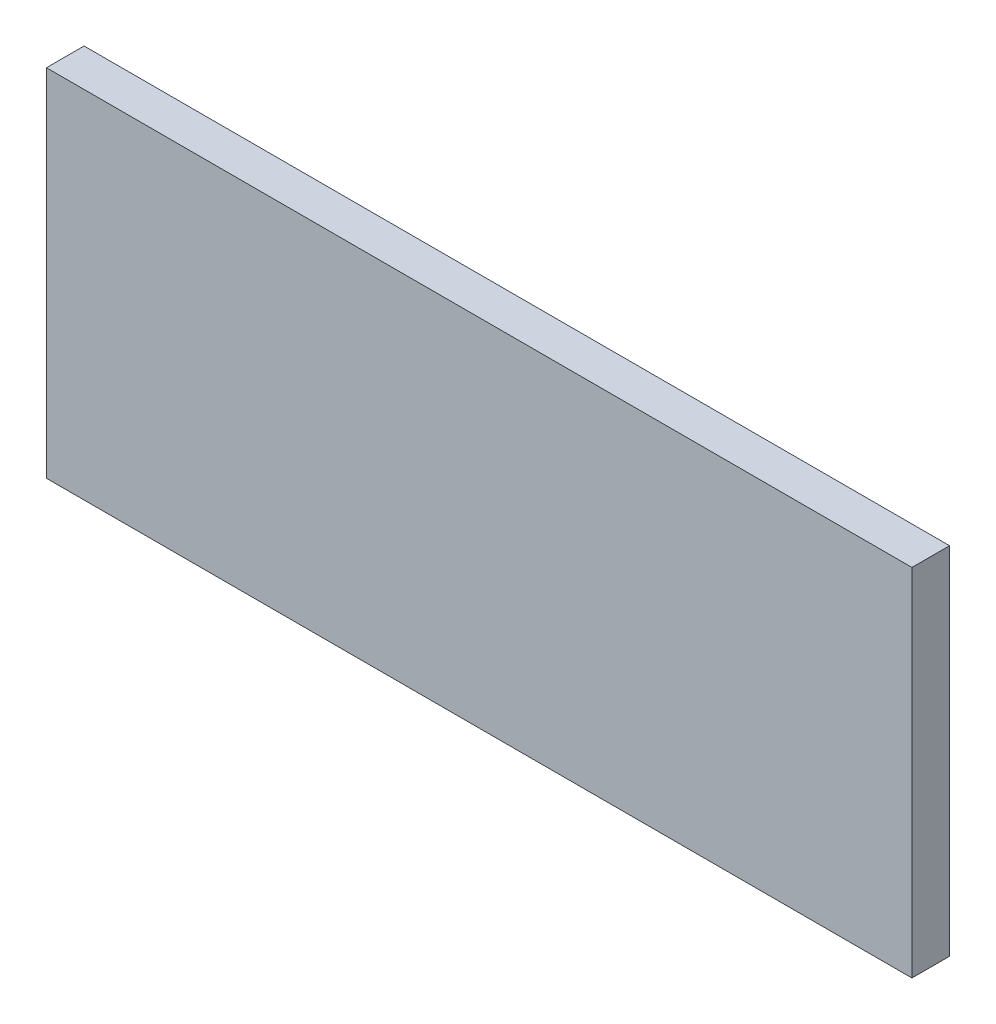
ISO-10303-21;
HEADER;
FILE_DESCRIPTION(('STEP AP214'),'2;1');
FILE_NAME('part.step','',(''),(''),'','','');
FILE_SCHEMA(('AUTOMOTIVE_DESIGN { 1 0 10303 214 1 1 1 1 }'));
ENDSEC;
DATA;
#1=APPLICATION_CONTEXT('core data for automotive mechanical design processes');
#2=APPLICATION_PROTOCOL_DEFINITION('international standard','automotive_design',2000,#1);
#3=PRODUCT_CONTEXT('',#1,'mechanical');
#4=PRODUCT('Part','Part','',(#3));
#5=PRODUCT_RELATED_PRODUCT_CATEGORY('part','',(#4));
#6=PRODUCT_DEFINITION_FORMATION('','',#4);
#7=PRODUCT_DEFINITION_CONTEXT('part definition',#1,'design');
#8=PRODUCT_DEFINITION('design','',#6,#7);
#9=PRODUCT_DEFINITION_SHAPE('','',#8);
#10=(LENGTH_UNIT() NAMED_UNIT(*) SI_UNIT(.MILLI.,.METRE.));
#11=(NAMED_UNIT(*) PLANE_ANGLE_UNIT() SI_UNIT($,.RADIAN.));
#12=(NAMED_UNIT(*) SI_UNIT($,.STERADIAN.) SOLID_ANGLE_UNIT());
#13=UNCERTAINTY_MEASURE_WITH_UNIT(LENGTH_MEASURE(1.E-05),#10,'distance_accuracy_value','');
#14=(GEOMETRIC_REPRESENTATION_CONTEXT(3) GLOBAL_UNCERTAINTY_ASSIGNED_CONTEXT((#13)) GLOBAL_UNIT_ASSIGNED_CONTEXT((#10,
#11,#12)) REPRESENTATION_CONTEXT('',''));
#15=CARTESIAN_POINT('',(0.,0.,0.));
#16=DIRECTION('',(0.,0.,1.));
#17=DIRECTION('',(1.,0.,0.));
#18=AXIS2_PLACEMENT_3D('',#15,#16,#17);
#19=CARTESIAN_POINT('',(-146.05,-60.,12.7));
#20=DIRECTION('',(0.,1.,0.));
#21=DIRECTION('',(-1.,0.,0.));
#22=AXIS2_PLACEMENT_3D('',#19,#20,#21);
#23=PLANE('',#22);
#24=DIRECTION('',(1.,0.,0.));
#25=VECTOR('',#24,1.);
#26=CARTESIAN_POINT('',(-146.05,-60.,0.));
#27=LINE('',#26,#25);
#28=CARTESIAN_POINT('',(-146.05,-60.,0.));
#29=VERTEX_POINT('',#28);
#30=CARTESIAN_POINT('',(146.05,-60.,0.));
#31=VERTEX_POINT('',#30);
#32=EDGE_CURVE('E107',#29,#31,#27,.T.);
#33=ORIENTED_EDGE('',*,*,#32,.T.);
#34=DIRECTION('',(0.,0.,-1.));
#35=VECTOR('',#34,1.);
#36=CARTESIAN_POINT('',(146.05,-60.,12.7));
#37=LINE('',#36,#35);
#38=CARTESIAN_POINT('',(146.05,-60.,12.7));
#39=VERTEX_POINT('',#38);
#40=EDGE_CURVE('E11',#39,#31,#37,.T.);
#41=ORIENTED_EDGE('',*,*,#40,.F.);
#42=DIRECTION('',(1.,0.,0.));
#43=VECTOR('',#42,1.);
#44=CARTESIAN_POINT('',(-146.05,-60.,12.7));
#45=LINE('',#44,#43);
#46=CARTESIAN_POINT('',(-146.05,-60.,12.7));
#47=VERTEX_POINT('',#46);
#48=EDGE_CURVE('E91',#47,#39,#45,.T.);
#49=ORIENTED_EDGE('',*,*,#48,.F.);
#50=DIRECTION('',(0.,0.,-1.));
#51=VECTOR('',#50,1.);
#52=CARTESIAN_POINT('',(-146.05,-60.,12.7));
#53=LINE('',#52,#51);
#54=EDGE_CURVE('E103',#47,#29,#53,.T.);
#55=ORIENTED_EDGE('',*,*,#54,.T.);
#56=EDGE_LOOP('',(#33,#41,#49,#55));
#57=FACE_BOUND('',#56,.T.);
#58=ADVANCED_FACE('F39',(#57),#23,.F.);
#59=CARTESIAN_POINT('',(146.05,-60.,12.7));
#60=DIRECTION('',(-1.,0.,0.));
#61=DIRECTION('',(0.,0.,1.));
#62=AXIS2_PLACEMENT_3D('',#59,#60,#61);
#63=PLANE('',#62);
#64=DIRECTION('',(0.,1.,0.));
#65=VECTOR('',#64,1.);
#66=CARTESIAN_POINT('',(146.05,-60.,0.));
#67=LINE('',#66,#65);
#68=CARTESIAN_POINT('',(146.05,60.,0.));
#69=VERTEX_POINT('',#68);
#70=EDGE_CURVE('E96',#31,#69,#67,.T.);
#71=ORIENTED_EDGE('',*,*,#70,.T.);
#72=DIRECTION('',(0.,0.,-1.));
#73=VECTOR('',#72,1.);
#74=CARTESIAN_POINT('',(146.05,60.,12.7));
#75=LINE('',#74,#73);
#76=CARTESIAN_POINT('',(146.05,60.,12.7));
#77=VERTEX_POINT('',#76);
#78=EDGE_CURVE('E48',#77,#69,#75,.T.);
#79=ORIENTED_EDGE('',*,*,#78,.F.);
#80=DIRECTION('',(0.,1.,0.));
#81=VECTOR('',#80,1.);
#82=CARTESIAN_POINT('',(146.05,-60.,12.7));
#83=LINE('',#82,#81);
#84=EDGE_CURVE('E86',#39,#77,#83,.T.);
#85=ORIENTED_EDGE('',*,*,#84,.F.);
#86=ORIENTED_EDGE('',*,*,#40,.T.);
#87=EDGE_LOOP('',(#71,#79,#85,#86));
#88=FACE_BOUND('',#87,.T.);
#89=ADVANCED_FACE('F95',(#88),#63,.F.);
#90=CARTESIAN_POINT('',(-146.05,60.,12.7));
#91=DIRECTION('',(0.,-1.,0.));
#92=DIRECTION('',(1.,0.,0.));
#93=AXIS2_PLACEMENT_3D('',#90,#91,#92);
#94=PLANE('',#93);
#95=DIRECTION('',(-1.,0.,0.));
#96=VECTOR('',#95,1.);
#97=CARTESIAN_POINT('',(-146.05,60.,0.));
#98=LINE('',#97,#96);
#99=CARTESIAN_POINT('',(-146.05,60.,0.));
#100=VERTEX_POINT('',#99);
#101=EDGE_CURVE('E73',#69,#100,#98,.T.);
#102=ORIENTED_EDGE('',*,*,#101,.T.);
#103=DIRECTION('',(0.,0.,-1.));
#104=VECTOR('',#103,1.);
#105=CARTESIAN_POINT('',(-146.05,60.,12.7));
#106=LINE('',#105,#104);
#107=CARTESIAN_POINT('',(-146.05,60.,12.7));
#108=VERTEX_POINT('',#107);
#109=EDGE_CURVE('E98',#108,#100,#106,.T.);
#110=ORIENTED_EDGE('',*,*,#109,.F.);
#111=DIRECTION('',(-1.,0.,0.));
#112=VECTOR('',#111,1.);
#113=CARTESIAN_POINT('',(-146.05,60.,12.7));
#114=LINE('',#113,#112);
#115=EDGE_CURVE('E89',#77,#108,#114,.T.);
#116=ORIENTED_EDGE('',*,*,#115,.F.);
#117=ORIENTED_EDGE('',*,*,#78,.T.);
#118=EDGE_LOOP('',(#102,#110,#116,#117));
#119=FACE_BOUND('',#118,.T.);
#120=ADVANCED_FACE('F99',(#119),#94,.F.);
#121=CARTESIAN_POINT('',(-146.05,-60.,12.7));
#122=DIRECTION('',(1.,0.,0.));
#123=DIRECTION('',(0.,0.,-1.));
#124=AXIS2_PLACEMENT_3D('',#121,#122,#123);
#125=PLANE('',#124);
#126=DIRECTION('',(0.,-1.,0.));
#127=VECTOR('',#126,1.);
#128=CARTESIAN_POINT('',(-146.05,-60.,0.));
#129=LINE('',#128,#127);
#130=EDGE_CURVE('E79',#100,#29,#129,.T.);
#131=ORIENTED_EDGE('',*,*,#130,.T.);
#132=ORIENTED_EDGE('',*,*,#54,.F.);
#133=DIRECTION('',(0.,-1.,0.));
#134=VECTOR('',#133,1.);
#135=CARTESIAN_POINT('',(-146.05,-60.,12.7));
#136=LINE('',#135,#134);
#137=EDGE_CURVE('E56',#108,#47,#136,.T.);
#138=ORIENTED_EDGE('',*,*,#137,.F.);
#139=ORIENTED_EDGE('',*,*,#109,.T.);
#140=EDGE_LOOP('',(#131,#132,#138,#139));
#141=FACE_BOUND('',#140,.T.);
#142=ADVANCED_FACE('F120',(#141),#125,.F.);
#143=CARTESIAN_POINT('',(0.,0.,12.7));
#144=DIRECTION('',(0.,0.,1.));
#145=DIRECTION('',(1.,0.,0.));
#146=AXIS2_PLACEMENT_3D('',#143,#144,#145);
#147=PLANE('',#146);
#148=ORIENTED_EDGE('',*,*,#48,.T.);
#149=ORIENTED_EDGE('',*,*,#84,.T.);
#150=ORIENTED_EDGE('',*,*,#115,.T.);
#151=ORIENTED_EDGE('',*,*,#137,.T.);
#152=EDGE_LOOP('',(#148,#149,#150,#151));
#153=FACE_BOUND('',#152,.T.);
#154=ADVANCED_FACE('F87',(#153),#147,.T.);
#155=CARTESIAN_POINT('',(0.,0.,0.));
#156=DIRECTION('',(0.,0.,1.));
#157=DIRECTION('',(1.,0.,0.));
#158=AXIS2_PLACEMENT_3D('',#155,#156,#157);
#159=PLANE('',#158);
#160=ORIENTED_EDGE('',*,*,#32,.F.);
#161=ORIENTED_EDGE('',*,*,#130,.F.);
#162=ORIENTED_EDGE('',*,*,#101,.F.);
#163=ORIENTED_EDGE('',*,*,#70,.F.);
#164=EDGE_LOOP('',(#160,#161,#162,#163));
#165=FACE_BOUND('',#164,.T.);
#166=ADVANCED_FACE('F123',(#165),#159,.F.);
#167=CLOSED_SHELL('',(#58,#89,#120,#142,#154,#166));
#168=MANIFOLD_SOLID_BREP('B2',#167);
#169=ADVANCED_BREP_SHAPE_REPRESENTATION('',(#18,#168),#14);
#170=SHAPE_DEFINITION_REPRESENTATION(#9,#169);
ENDSEC;
END-ISO-10303-21;
